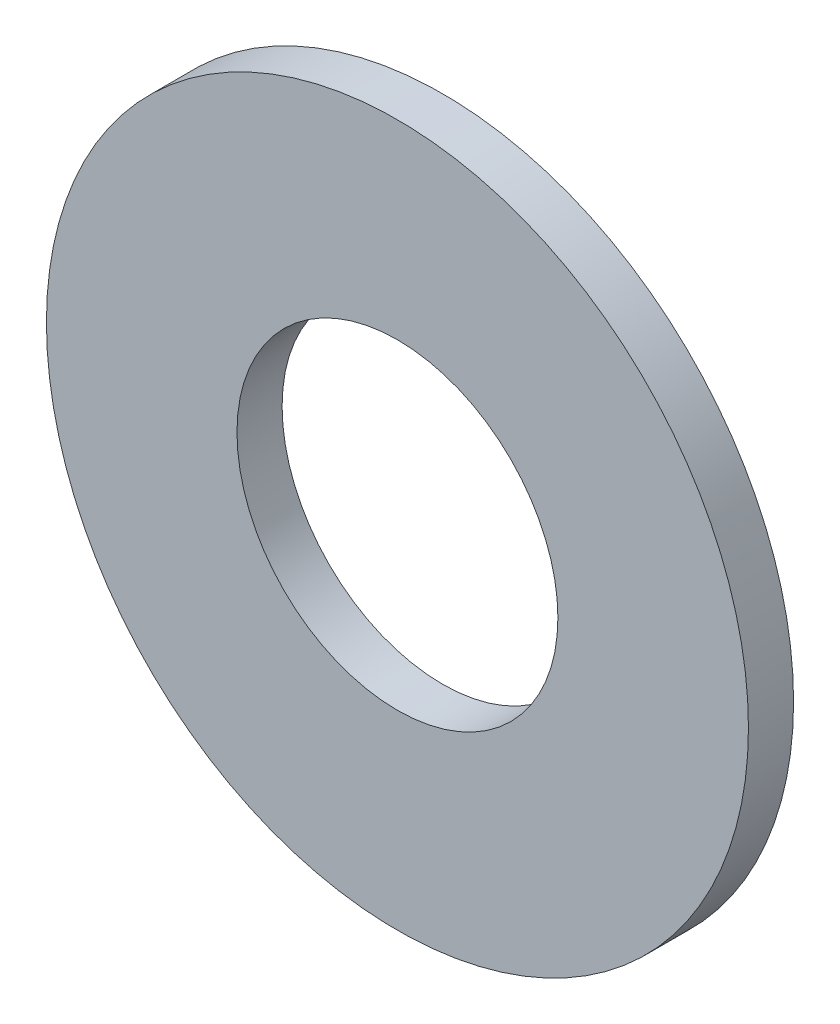
ISO-10303-21;
HEADER;
FILE_DESCRIPTION(('STEP AP214'),'2;1');
FILE_NAME('part.step','',(''),(''),'','','');
FILE_SCHEMA(('AUTOMOTIVE_DESIGN { 1 0 10303 214 1 1 1 1 }'));
ENDSEC;
DATA;
#1=APPLICATION_CONTEXT('core data for automotive mechanical design processes');
#2=APPLICATION_PROTOCOL_DEFINITION('international standard','automotive_design',2000,#1);
#3=PRODUCT_CONTEXT('',#1,'mechanical');
#4=PRODUCT('Part','Part','',(#3));
#5=PRODUCT_RELATED_PRODUCT_CATEGORY('part','',(#4));
#6=PRODUCT_DEFINITION_FORMATION('','',#4);
#7=PRODUCT_DEFINITION_CONTEXT('part definition',#1,'design');
#8=PRODUCT_DEFINITION('design','',#6,#7);
#9=PRODUCT_DEFINITION_SHAPE('','',#8);
#10=(LENGTH_UNIT() NAMED_UNIT(*) SI_UNIT(.MILLI.,.METRE.));
#11=(NAMED_UNIT(*) PLANE_ANGLE_UNIT() SI_UNIT($,.RADIAN.));
#12=(NAMED_UNIT(*) SI_UNIT($,.STERADIAN.) SOLID_ANGLE_UNIT());
#13=UNCERTAINTY_MEASURE_WITH_UNIT(LENGTH_MEASURE(1.E-05),#10,'distance_accuracy_value','');
#14=(GEOMETRIC_REPRESENTATION_CONTEXT(3) GLOBAL_UNCERTAINTY_ASSIGNED_CONTEXT((#13)) GLOBAL_UNIT_ASSIGNED_CONTEXT((#10,
#11,#12)) REPRESENTATION_CONTEXT('',''));
#15=CARTESIAN_POINT('',(0.,0.,0.));
#16=DIRECTION('',(0.,0.,1.));
#17=DIRECTION('',(1.,0.,0.));
#18=AXIS2_PLACEMENT_3D('',#15,#16,#17);
#19=CARTESIAN_POINT('',(0.,0.,0.45));
#20=DIRECTION('',(0.,0.,1.));
#21=DIRECTION('',(1.,0.,0.));
#22=AXIS2_PLACEMENT_3D('',#19,#20,#21);
#23=PLANE('',#22);
#24=CARTESIAN_POINT('',(0.,0.,0.45));
#25=DIRECTION('',(0.,0.,1.));
#26=DIRECTION('',(1.,0.,0.));
#27=AXIS2_PLACEMENT_3D('',#24,#25,#26);
#28=CIRCLE('',#27,3.5);
#29=CARTESIAN_POINT('',(3.5,0.,0.45));
#30=VERTEX_POINT('',#29);
#31=EDGE_CURVE('E10',#30,#30,#28,.T.);
#32=ORIENTED_EDGE('',*,*,#31,.T.);
#33=EDGE_LOOP('',(#32));
#34=FACE_BOUND('',#33,.T.);
#35=CARTESIAN_POINT('',(0.,0.,0.45));
#36=DIRECTION('',(0.,0.,1.));
#37=DIRECTION('',(1.,0.,0.));
#38=AXIS2_PLACEMENT_3D('',#35,#36,#37);
#39=CIRCLE('',#38,1.6);
#40=CARTESIAN_POINT('',(1.6,0.,0.45));
#41=VERTEX_POINT('',#40);
#42=EDGE_CURVE('E41',#41,#41,#39,.T.);
#43=ORIENTED_EDGE('',*,*,#42,.F.);
#44=EDGE_LOOP('',(#43));
#45=FACE_BOUND('',#44,.T.);
#46=ADVANCED_FACE('F30',(#34,#45),#23,.T.);
#47=CARTESIAN_POINT('',(0.,0.,0.));
#48=DIRECTION('',(0.,0.,1.));
#49=DIRECTION('',(1.,0.,0.));
#50=AXIS2_PLACEMENT_3D('',#47,#48,#49);
#51=PLANE('',#50);
#52=CARTESIAN_POINT('',(0.,0.,0.));
#53=DIRECTION('',(0.,0.,1.));
#54=DIRECTION('',(1.,0.,0.));
#55=AXIS2_PLACEMENT_3D('',#52,#53,#54);
#56=CIRCLE('',#55,3.5);
#57=CARTESIAN_POINT('',(3.5,0.,0.));
#58=VERTEX_POINT('',#57);
#59=EDGE_CURVE('E34',#58,#58,#56,.T.);
#60=ORIENTED_EDGE('',*,*,#59,.F.);
#61=EDGE_LOOP('',(#60));
#62=FACE_BOUND('',#61,.T.);
#63=CARTESIAN_POINT('',(0.,0.,0.));
#64=DIRECTION('',(0.,0.,1.));
#65=DIRECTION('',(1.,0.,0.));
#66=AXIS2_PLACEMENT_3D('',#63,#64,#65);
#67=CIRCLE('',#66,1.6);
#68=CARTESIAN_POINT('',(1.6,0.,0.));
#69=VERTEX_POINT('',#68);
#70=EDGE_CURVE('E43',#69,#69,#67,.T.);
#71=ORIENTED_EDGE('',*,*,#70,.T.);
#72=EDGE_LOOP('',(#71));
#73=FACE_BOUND('',#72,.T.);
#74=ADVANCED_FACE('F53',(#62,#73),#51,.F.);
#75=CARTESIAN_POINT('',(0.,0.,0.45));
#76=DIRECTION('',(0.,0.,-1.));
#77=DIRECTION('',(-1.,0.,0.));
#78=AXIS2_PLACEMENT_3D('',#75,#76,#77);
#79=CYLINDRICAL_SURFACE('',#78,3.5);
#80=ORIENTED_EDGE('',*,*,#31,.F.);
#81=EDGE_LOOP('',(#80));
#82=FACE_BOUND('',#81,.T.);
#83=ORIENTED_EDGE('',*,*,#59,.T.);
#84=EDGE_LOOP('',(#83));
#85=FACE_BOUND('',#84,.T.);
#86=ADVANCED_FACE('F32',(#82,#85),#79,.T.);
#87=CARTESIAN_POINT('',(0.,0.,0.45));
#88=DIRECTION('',(0.,0.,-1.));
#89=DIRECTION('',(-1.,0.,0.));
#90=AXIS2_PLACEMENT_3D('',#87,#88,#89);
#91=CYLINDRICAL_SURFACE('',#90,1.6);
#92=ORIENTED_EDGE('',*,*,#42,.T.);
#93=EDGE_LOOP('',(#92));
#94=FACE_BOUND('',#93,.T.);
#95=ORIENTED_EDGE('',*,*,#70,.F.);
#96=EDGE_LOOP('',(#95));
#97=FACE_BOUND('',#96,.T.);
#98=ADVANCED_FACE('F49',(#94,#97),#91,.F.);
#99=CLOSED_SHELL('',(#46,#74,#86,#98));
#100=MANIFOLD_SOLID_BREP('B2',#99);
#101=ADVANCED_BREP_SHAPE_REPRESENTATION('',(#18,#100),#14);
#102=SHAPE_DEFINITION_REPRESENTATION(#9,#101);
ENDSEC;
END-ISO-10303-21;
